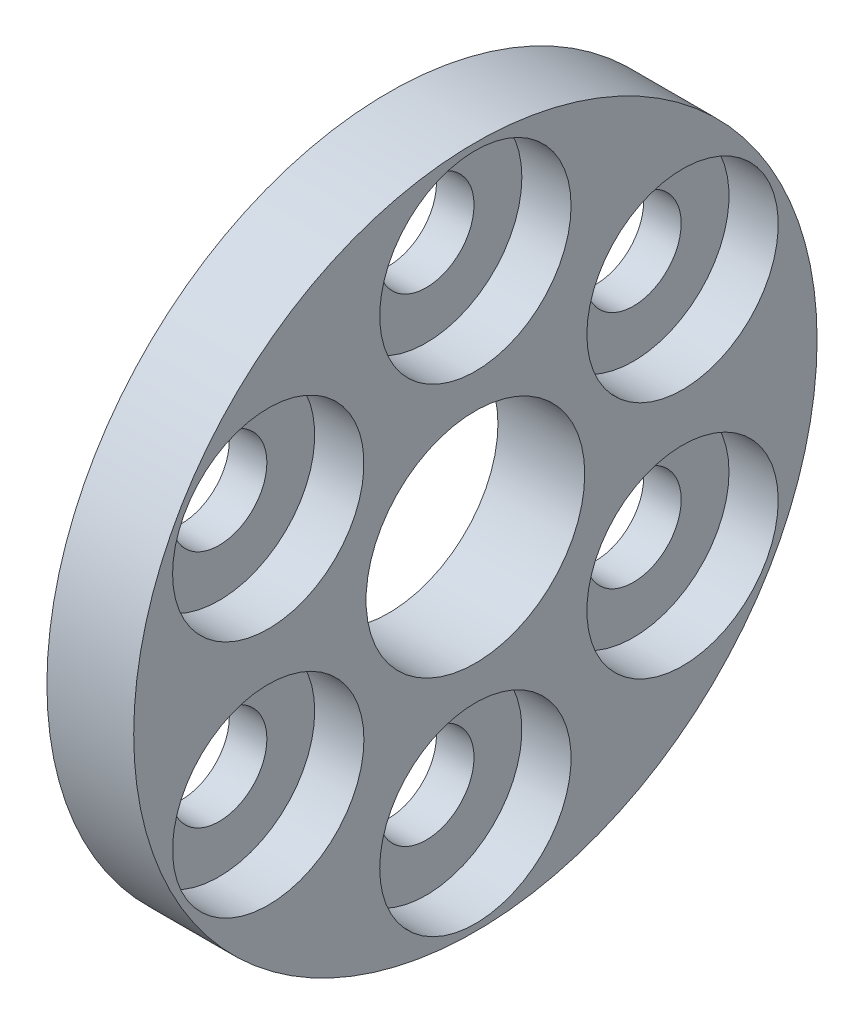
ISO-10303-21;
HEADER;
FILE_DESCRIPTION(('STEP AP214'),'2;1');
FILE_NAME('part.step','',(''),(''),'','','');
FILE_SCHEMA(('AUTOMOTIVE_DESIGN { 1 0 10303 214 1 1 1 1 }'));
ENDSEC;
DATA;
#1=APPLICATION_CONTEXT('core data for automotive mechanical design processes');
#2=APPLICATION_PROTOCOL_DEFINITION('international standard','automotive_design',2000,#1);
#3=PRODUCT_CONTEXT('',#1,'mechanical');
#4=PRODUCT('Part','Part','',(#3));
#5=PRODUCT_RELATED_PRODUCT_CATEGORY('part','',(#4));
#6=PRODUCT_DEFINITION_FORMATION('','',#4);
#7=PRODUCT_DEFINITION_CONTEXT('part definition',#1,'design');
#8=PRODUCT_DEFINITION('design','',#6,#7);
#9=PRODUCT_DEFINITION_SHAPE('','',#8);
#10=(LENGTH_UNIT() NAMED_UNIT(*) SI_UNIT(.MILLI.,.METRE.));
#11=(NAMED_UNIT(*) PLANE_ANGLE_UNIT() SI_UNIT($,.RADIAN.));
#12=(NAMED_UNIT(*) SI_UNIT($,.STERADIAN.) SOLID_ANGLE_UNIT());
#13=UNCERTAINTY_MEASURE_WITH_UNIT(LENGTH_MEASURE(1.E-05),#10,'distance_accuracy_value','');
#14=(GEOMETRIC_REPRESENTATION_CONTEXT(3) GLOBAL_UNCERTAINTY_ASSIGNED_CONTEXT((#13)) GLOBAL_UNIT_ASSIGNED_CONTEXT((#10,
#11,#12)) REPRESENTATION_CONTEXT('',''));
#15=CARTESIAN_POINT('',(0.,0.,0.));
#16=DIRECTION('',(0.,0.,1.));
#17=DIRECTION('',(1.,0.,0.));
#18=AXIS2_PLACEMENT_3D('',#15,#16,#17);
#19=CARTESIAN_POINT('',(0.,4.37499999999998,7.57772228311385));
#20=DIRECTION('',(1.,0.,0.));
#21=DIRECTION('',(0.,0.,-1.));
#22=AXIS2_PLACEMENT_3D('',#19,#20,#21);
#23=CYLINDRICAL_SURFACE('',#22,1.75);
#24=CARTESIAN_POINT('',(0.,4.37499999999998,7.57772228311385));
#25=DIRECTION('',(1.,0.,0.));
#26=DIRECTION('',(0.,0.86602540378444,-0.499999999999998));
#27=AXIS2_PLACEMENT_3D('',#24,#25,#26);
#28=CIRCLE('',#27,1.75);
#29=CARTESIAN_POINT('',(0.,5.89054445662275,6.70272228311385));
#30=VERTEX_POINT('',#29);
#31=EDGE_CURVE('E382',#30,#30,#28,.T.);
#32=ORIENTED_EDGE('',*,*,#31,.F.);
#33=EDGE_LOOP('',(#32));
#34=FACE_BOUND('',#33,.T.);
#35=CARTESIAN_POINT('',(1.375,4.37499999999998,7.57772228311385));
#36=DIRECTION('',(1.,0.,0.));
#37=DIRECTION('',(0.,0.,-1.));
#38=AXIS2_PLACEMENT_3D('',#35,#36,#37);
#39=CIRCLE('',#38,1.75);
#40=CARTESIAN_POINT('',(1.375,4.37499999999998,5.82772228311385));
#41=VERTEX_POINT('',#40);
#42=EDGE_CURVE('E335',#41,#41,#39,.F.);
#43=ORIENTED_EDGE('',*,*,#42,.F.);
#44=EDGE_LOOP('',(#43));
#45=FACE_BOUND('',#44,.T.);
#46=ADVANCED_FACE('F331',(#34,#45),#23,.F.);
#47=CARTESIAN_POINT('',(0.,-4.37500000000004,7.57772228311382));
#48=DIRECTION('',(1.,0.,0.));
#49=DIRECTION('',(0.,0.,-1.));
#50=AXIS2_PLACEMENT_3D('',#47,#48,#49);
#51=CYLINDRICAL_SURFACE('',#50,1.75);
#52=CARTESIAN_POINT('',(0.,-4.37500000000004,7.57772228311382));
#53=DIRECTION('',(1.,0.,0.));
#54=DIRECTION('',(0.,0.866025403784436,0.500000000000004));
#55=AXIS2_PLACEMENT_3D('',#52,#53,#54);
#56=CIRCLE('',#55,1.75);
#57=CARTESIAN_POINT('',(0.,-2.85945554337727,8.45272228311383));
#58=VERTEX_POINT('',#57);
#59=EDGE_CURVE('E386',#58,#58,#56,.T.);
#60=ORIENTED_EDGE('',*,*,#59,.F.);
#61=EDGE_LOOP('',(#60));
#62=FACE_BOUND('',#61,.T.);
#63=CARTESIAN_POINT('',(1.375,-4.37500000000004,7.57772228311382));
#64=DIRECTION('',(1.,0.,0.));
#65=DIRECTION('',(0.,0.,-1.));
#66=AXIS2_PLACEMENT_3D('',#63,#64,#65);
#67=CIRCLE('',#66,1.75);
#68=CARTESIAN_POINT('',(1.375,-4.37500000000004,5.82772228311382));
#69=VERTEX_POINT('',#68);
#70=EDGE_CURVE('E364',#69,#69,#67,.F.);
#71=ORIENTED_EDGE('',*,*,#70,.F.);
#72=EDGE_LOOP('',(#71));
#73=FACE_BOUND('',#72,.T.);
#74=ADVANCED_FACE('F416',(#62,#73),#51,.F.);
#75=CARTESIAN_POINT('',(0.,-8.75,0.));
#76=DIRECTION('',(1.,0.,0.));
#77=DIRECTION('',(0.,0.,-1.));
#78=AXIS2_PLACEMENT_3D('',#75,#76,#77);
#79=CYLINDRICAL_SURFACE('',#78,1.75);
#80=CARTESIAN_POINT('',(0.,-8.75,0.));
#81=DIRECTION('',(1.,0.,0.));
#82=DIRECTION('',(0.,0.,1.));
#83=AXIS2_PLACEMENT_3D('',#80,#81,#82);
#84=CIRCLE('',#83,1.75);
#85=CARTESIAN_POINT('',(0.,-8.75,1.75));
#86=VERTEX_POINT('',#85);
#87=EDGE_CURVE('E378',#86,#86,#84,.T.);
#88=ORIENTED_EDGE('',*,*,#87,.F.);
#89=EDGE_LOOP('',(#88));
#90=FACE_BOUND('',#89,.T.);
#91=CARTESIAN_POINT('',(1.375,-8.75,0.));
#92=DIRECTION('',(1.,0.,0.));
#93=DIRECTION('',(0.,0.,-1.));
#94=AXIS2_PLACEMENT_3D('',#91,#92,#93);
#95=CIRCLE('',#94,1.75);
#96=CARTESIAN_POINT('',(1.375,-8.75,-1.75));
#97=VERTEX_POINT('',#96);
#98=EDGE_CURVE('E362',#97,#97,#95,.F.);
#99=ORIENTED_EDGE('',*,*,#98,.F.);
#100=EDGE_LOOP('',(#99));
#101=FACE_BOUND('',#100,.T.);
#102=ADVANCED_FACE('F422',(#90,#101),#79,.F.);
#103=CARTESIAN_POINT('',(0.,-4.37499999999993,-7.57772228311388));
#104=DIRECTION('',(1.,0.,0.));
#105=DIRECTION('',(0.,0.,-1.));
#106=AXIS2_PLACEMENT_3D('',#103,#104,#105);
#107=CYLINDRICAL_SURFACE('',#106,1.75);
#108=CARTESIAN_POINT('',(0.,-4.37499999999993,-7.57772228311388));
#109=DIRECTION('',(1.,0.,0.));
#110=DIRECTION('',(0.,-0.866025403784443,0.499999999999992));
#111=AXIS2_PLACEMENT_3D('',#108,#109,#110);
#112=CIRCLE('',#111,1.75);
#113=CARTESIAN_POINT('',(0.,-5.89054445662271,-6.70272228311389));
#114=VERTEX_POINT('',#113);
#115=EDGE_CURVE('E373',#114,#114,#112,.T.);
#116=ORIENTED_EDGE('',*,*,#115,.F.);
#117=EDGE_LOOP('',(#116));
#118=FACE_BOUND('',#117,.T.);
#119=CARTESIAN_POINT('',(1.375,-4.37499999999993,-7.57772228311388));
#120=DIRECTION('',(1.,0.,0.));
#121=DIRECTION('',(0.,0.,-1.));
#122=AXIS2_PLACEMENT_3D('',#119,#120,#121);
#123=CIRCLE('',#122,1.75);
#124=CARTESIAN_POINT('',(1.375,-4.37499999999993,-9.32772228311388));
#125=VERTEX_POINT('',#124);
#126=EDGE_CURVE('E358',#125,#125,#123,.F.);
#127=ORIENTED_EDGE('',*,*,#126,.F.);
#128=EDGE_LOOP('',(#127));
#129=FACE_BOUND('',#128,.T.);
#130=ADVANCED_FACE('F482',(#118,#129),#107,.F.);
#131=CARTESIAN_POINT('',(0.,4.37500000000009,-7.57772228311379));
#132=DIRECTION('',(1.,0.,0.));
#133=DIRECTION('',(0.,0.,-1.));
#134=AXIS2_PLACEMENT_3D('',#131,#132,#133);
#135=CYLINDRICAL_SURFACE('',#134,1.75);
#136=CARTESIAN_POINT('',(0.,4.37500000000009,-7.57772228311379));
#137=DIRECTION('',(1.,0.,0.));
#138=DIRECTION('',(0.,-0.866025403784433,-0.50000000000001));
#139=AXIS2_PLACEMENT_3D('',#136,#137,#138);
#140=CIRCLE('',#139,1.75);
#141=CARTESIAN_POINT('',(0.,2.85945554337733,-8.45272228311381));
#142=VERTEX_POINT('',#141);
#143=EDGE_CURVE('E369',#142,#142,#140,.T.);
#144=ORIENTED_EDGE('',*,*,#143,.F.);
#145=EDGE_LOOP('',(#144));
#146=FACE_BOUND('',#145,.T.);
#147=CARTESIAN_POINT('',(1.375,4.37500000000009,-7.57772228311379));
#148=DIRECTION('',(1.,0.,0.));
#149=DIRECTION('',(0.,0.,-1.));
#150=AXIS2_PLACEMENT_3D('',#147,#148,#149);
#151=CIRCLE('',#150,1.75);
#152=CARTESIAN_POINT('',(1.375,4.37500000000009,-9.32772228311379));
#153=VERTEX_POINT('',#152);
#154=EDGE_CURVE('E355',#153,#153,#151,.F.);
#155=ORIENTED_EDGE('',*,*,#154,.F.);
#156=EDGE_LOOP('',(#155));
#157=FACE_BOUND('',#156,.T.);
#158=ADVANCED_FACE('F429',(#146,#157),#135,.F.);
#159=CARTESIAN_POINT('',(0.,8.75,0.));
#160=DIRECTION('',(1.,0.,0.));
#161=DIRECTION('',(0.,0.,-1.));
#162=AXIS2_PLACEMENT_3D('',#159,#160,#161);
#163=CYLINDRICAL_SURFACE('',#162,1.75);
#164=CARTESIAN_POINT('',(0.,8.75,0.));
#165=DIRECTION('',(1.,0.,0.));
#166=DIRECTION('',(0.,0.,-1.));
#167=AXIS2_PLACEMENT_3D('',#164,#165,#166);
#168=CIRCLE('',#167,1.75);
#169=CARTESIAN_POINT('',(0.,8.75,-1.75));
#170=VERTEX_POINT('',#169);
#171=EDGE_CURVE('E353',#170,#170,#168,.T.);
#172=ORIENTED_EDGE('',*,*,#171,.F.);
#173=EDGE_LOOP('',(#172));
#174=FACE_BOUND('',#173,.T.);
#175=CARTESIAN_POINT('',(1.375,8.75,0.));
#176=DIRECTION('',(1.,0.,0.));
#177=DIRECTION('',(0.,0.,-1.));
#178=AXIS2_PLACEMENT_3D('',#175,#176,#177);
#179=CIRCLE('',#178,1.75);
#180=CARTESIAN_POINT('',(1.375,8.75,-1.75));
#181=VERTEX_POINT('',#180);
#182=EDGE_CURVE('E350',#181,#181,#179,.F.);
#183=ORIENTED_EDGE('',*,*,#182,.F.);
#184=EDGE_LOOP('',(#183));
#185=FACE_BOUND('',#184,.T.);
#186=ADVANCED_FACE('F410',(#174,#185),#163,.F.);
#187=CARTESIAN_POINT('',(3.175,0.,0.));
#188=DIRECTION('',(-1.,0.,0.));
#189=DIRECTION('',(0.,0.,1.));
#190=AXIS2_PLACEMENT_3D('',#187,#188,#189);
#191=CYLINDRICAL_SURFACE('',#190,12.5);
#192=CARTESIAN_POINT('',(3.175,0.,0.));
#193=DIRECTION('',(1.,0.,0.));
#194=DIRECTION('',(0.,0.,-1.));
#195=AXIS2_PLACEMENT_3D('',#192,#193,#194);
#196=CIRCLE('',#195,12.5);
#197=CARTESIAN_POINT('',(3.175,0.,-12.5));
#198=VERTEX_POINT('',#197);
#199=EDGE_CURVE('E11',#198,#198,#196,.T.);
#200=ORIENTED_EDGE('',*,*,#199,.F.);
#201=EDGE_LOOP('',(#200));
#202=FACE_BOUND('',#201,.T.);
#203=CARTESIAN_POINT('',(0.,0.,0.));
#204=DIRECTION('',(1.,0.,0.));
#205=DIRECTION('',(0.,0.,-1.));
#206=AXIS2_PLACEMENT_3D('',#203,#204,#205);
#207=CIRCLE('',#206,12.5);
#208=CARTESIAN_POINT('',(0.,0.,-12.5));
#209=VERTEX_POINT('',#208);
#210=EDGE_CURVE('E339',#209,#209,#207,.T.);
#211=ORIENTED_EDGE('',*,*,#210,.T.);
#212=EDGE_LOOP('',(#211));
#213=FACE_BOUND('',#212,.T.);
#214=ADVANCED_FACE('F333',(#202,#213),#191,.T.);
#215=CARTESIAN_POINT('',(3.175,0.,0.));
#216=DIRECTION('',(1.,0.,0.));
#217=DIRECTION('',(0.,0.,-1.));
#218=AXIS2_PLACEMENT_3D('',#215,#216,#217);
#219=PLANE('',#218);
#220=CARTESIAN_POINT('',(3.175,4.37500000000009,-7.57772228311379));
#221=DIRECTION('',(1.,0.,0.));
#222=DIRECTION('',(0.,-0.866025403784433,-0.50000000000001));
#223=AXIS2_PLACEMENT_3D('',#220,#221,#222);
#224=CIRCLE('',#223,3.5);
#225=CARTESIAN_POINT('',(3.175,1.34391108675457,-9.32772228311382));
#226=VERTEX_POINT('',#225);
#227=EDGE_CURVE('E651',#226,#226,#224,.T.);
#228=ORIENTED_EDGE('',*,*,#227,.F.);
#229=EDGE_LOOP('',(#228));
#230=FACE_BOUND('',#229,.T.);
#231=CARTESIAN_POINT('',(3.175,-4.37499999999993,-7.57772228311388));
#232=DIRECTION('',(1.,0.,0.));
#233=DIRECTION('',(0.,-0.866025403784443,0.499999999999992));
#234=AXIS2_PLACEMENT_3D('',#231,#232,#233);
#235=CIRCLE('',#234,3.5);
#236=CARTESIAN_POINT('',(3.175,-7.40608891324548,-5.82772228311391));
#237=VERTEX_POINT('',#236);
#238=EDGE_CURVE('E643',#237,#237,#235,.T.);
#239=ORIENTED_EDGE('',*,*,#238,.F.);
#240=EDGE_LOOP('',(#239));
#241=FACE_BOUND('',#240,.T.);
#242=CARTESIAN_POINT('',(3.175,-4.37500000000004,7.57772228311382));
#243=DIRECTION('',(1.,0.,0.));
#244=DIRECTION('',(0.,0.866025403784436,0.500000000000004));
#245=AXIS2_PLACEMENT_3D('',#242,#243,#244);
#246=CIRCLE('',#245,3.5);
#247=CARTESIAN_POINT('',(3.175,-1.34391108675451,9.32772228311383));
#248=VERTEX_POINT('',#247);
#249=EDGE_CURVE('E620',#248,#248,#246,.T.);
#250=ORIENTED_EDGE('',*,*,#249,.F.);
#251=EDGE_LOOP('',(#250));
#252=FACE_BOUND('',#251,.T.);
#253=CARTESIAN_POINT('',(3.175,-8.75,0.));
#254=DIRECTION('',(1.,0.,0.));
#255=DIRECTION('',(0.,0.,1.));
#256=AXIS2_PLACEMENT_3D('',#253,#254,#255);
#257=CIRCLE('',#256,3.5);
#258=CARTESIAN_POINT('',(3.175,-8.75,3.5));
#259=VERTEX_POINT('',#258);
#260=EDGE_CURVE('E650',#259,#259,#257,.T.);
#261=ORIENTED_EDGE('',*,*,#260,.F.);
#262=EDGE_LOOP('',(#261));
#263=FACE_BOUND('',#262,.T.);
#264=CARTESIAN_POINT('',(3.175,4.37499999999998,7.57772228311385));
#265=DIRECTION('',(1.,0.,0.));
#266=DIRECTION('',(0.,0.86602540378444,-0.499999999999998));
#267=AXIS2_PLACEMENT_3D('',#264,#265,#266);
#268=CIRCLE('',#267,3.5);
#269=CARTESIAN_POINT('',(3.175,7.40608891324552,5.82772228311386));
#270=VERTEX_POINT('',#269);
#271=EDGE_CURVE('E614',#270,#270,#268,.T.);
#272=ORIENTED_EDGE('',*,*,#271,.F.);
#273=EDGE_LOOP('',(#272));
#274=FACE_BOUND('',#273,.T.);
#275=CARTESIAN_POINT('',(3.175,8.75,0.));
#276=DIRECTION('',(1.,0.,0.));
#277=DIRECTION('',(0.,0.,-1.));
#278=AXIS2_PLACEMENT_3D('',#275,#276,#277);
#279=CIRCLE('',#278,3.5);
#280=CARTESIAN_POINT('',(3.175,8.75,-3.5));
#281=VERTEX_POINT('',#280);
#282=EDGE_CURVE('E385',#281,#281,#279,.T.);
#283=ORIENTED_EDGE('',*,*,#282,.F.);
#284=EDGE_LOOP('',(#283));
#285=FACE_BOUND('',#284,.T.);
#286=CARTESIAN_POINT('',(3.175,0.,0.));
#287=DIRECTION('',(1.,0.,0.));
#288=DIRECTION('',(0.,0.,-1.));
#289=AXIS2_PLACEMENT_3D('',#286,#287,#288);
#290=CIRCLE('',#289,4.);
#291=CARTESIAN_POINT('',(3.175,0.,-4.));
#292=VERTEX_POINT('',#291);
#293=EDGE_CURVE('E347',#292,#292,#290,.T.);
#294=ORIENTED_EDGE('',*,*,#293,.F.);
#295=EDGE_LOOP('',(#294));
#296=FACE_BOUND('',#295,.T.);
#297=ORIENTED_EDGE('',*,*,#199,.T.);
#298=EDGE_LOOP('',(#297));
#299=FACE_BOUND('',#298,.T.);
#300=ADVANCED_FACE('F400',(#230,#241,#252,#263,#274,#285,#296,#299),#219,.T.);
#301=CARTESIAN_POINT('',(0.,0.,0.));
#302=DIRECTION('',(1.,0.,0.));
#303=DIRECTION('',(0.,0.,-1.));
#304=AXIS2_PLACEMENT_3D('',#301,#302,#303);
#305=PLANE('',#304);
#306=ORIENTED_EDGE('',*,*,#143,.T.);
#307=EDGE_LOOP('',(#306));
#308=FACE_BOUND('',#307,.T.);
#309=ORIENTED_EDGE('',*,*,#115,.T.);
#310=EDGE_LOOP('',(#309));
#311=FACE_BOUND('',#310,.T.);
#312=ORIENTED_EDGE('',*,*,#87,.T.);
#313=EDGE_LOOP('',(#312));
#314=FACE_BOUND('',#313,.T.);
#315=ORIENTED_EDGE('',*,*,#59,.T.);
#316=EDGE_LOOP('',(#315));
#317=FACE_BOUND('',#316,.T.);
#318=ORIENTED_EDGE('',*,*,#31,.T.);
#319=EDGE_LOOP('',(#318));
#320=FACE_BOUND('',#319,.T.);
#321=ORIENTED_EDGE('',*,*,#171,.T.);
#322=EDGE_LOOP('',(#321));
#323=FACE_BOUND('',#322,.T.);
#324=CARTESIAN_POINT('',(0.,0.,0.));
#325=DIRECTION('',(1.,0.,0.));
#326=DIRECTION('',(0.,0.,-1.));
#327=AXIS2_PLACEMENT_3D('',#324,#325,#326);
#328=CIRCLE('',#327,4.);
#329=CARTESIAN_POINT('',(0.,0.,-4.));
#330=VERTEX_POINT('',#329);
#331=EDGE_CURVE('E344',#330,#330,#328,.T.);
#332=ORIENTED_EDGE('',*,*,#331,.T.);
#333=EDGE_LOOP('',(#332));
#334=FACE_BOUND('',#333,.T.);
#335=ORIENTED_EDGE('',*,*,#210,.F.);
#336=EDGE_LOOP('',(#335));
#337=FACE_BOUND('',#336,.T.);
#338=ADVANCED_FACE('F402',(#308,#311,#314,#317,#320,#323,#334,#337),#305,.F.);
#339=CARTESIAN_POINT('',(0.,0.,0.));
#340=DIRECTION('',(1.,0.,0.));
#341=DIRECTION('',(0.,0.,-1.));
#342=AXIS2_PLACEMENT_3D('',#339,#340,#341);
#343=CYLINDRICAL_SURFACE('',#342,4.);
#344=ORIENTED_EDGE('',*,*,#331,.F.);
#345=EDGE_LOOP('',(#344));
#346=FACE_BOUND('',#345,.T.);
#347=ORIENTED_EDGE('',*,*,#293,.T.);
#348=EDGE_LOOP('',(#347));
#349=FACE_BOUND('',#348,.T.);
#350=ADVANCED_FACE('F398',(#346,#349),#343,.F.);
#351=CARTESIAN_POINT('',(1.375,0.,0.));
#352=DIRECTION('',(1.,0.,0.));
#353=DIRECTION('',(0.,0.,-1.));
#354=AXIS2_PLACEMENT_3D('',#351,#352,#353);
#355=PLANE('',#354);
#356=CARTESIAN_POINT('',(1.375,8.75,0.));
#357=DIRECTION('',(1.,0.,0.));
#358=DIRECTION('',(0.,0.,-1.));
#359=AXIS2_PLACEMENT_3D('',#356,#357,#358);
#360=CIRCLE('',#359,3.5);
#361=CARTESIAN_POINT('',(1.375,8.75,-3.5));
#362=VERTEX_POINT('',#361);
#363=EDGE_CURVE('E354',#362,#362,#360,.T.);
#364=ORIENTED_EDGE('',*,*,#363,.T.);
#365=EDGE_LOOP('',(#364));
#366=FACE_BOUND('',#365,.T.);
#367=ORIENTED_EDGE('',*,*,#182,.T.);
#368=EDGE_LOOP('',(#367));
#369=FACE_BOUND('',#368,.T.);
#370=ADVANCED_FACE('F431',(#366,#369),#355,.T.);
#371=CARTESIAN_POINT('',(1.375,8.75,0.));
#372=DIRECTION('',(1.,0.,0.));
#373=DIRECTION('',(0.,0.,-1.));
#374=AXIS2_PLACEMENT_3D('',#371,#372,#373);
#375=CYLINDRICAL_SURFACE('',#374,3.5);
#376=ORIENTED_EDGE('',*,*,#363,.F.);
#377=EDGE_LOOP('',(#376));
#378=FACE_BOUND('',#377,.T.);
#379=ORIENTED_EDGE('',*,*,#282,.T.);
#380=EDGE_LOOP('',(#379));
#381=FACE_BOUND('',#380,.T.);
#382=ADVANCED_FACE('F434',(#378,#381),#375,.F.);
#383=CARTESIAN_POINT('',(1.375,0.,0.));
#384=DIRECTION('',(1.,0.,0.));
#385=DIRECTION('',(0.,-0.866025403784433,-0.50000000000001));
#386=AXIS2_PLACEMENT_3D('',#383,#384,#385);
#387=PLANE('',#386);
#388=CARTESIAN_POINT('',(1.375,4.37500000000009,-7.57772228311379));
#389=DIRECTION('',(1.,0.,0.));
#390=DIRECTION('',(0.,-0.866025403784433,-0.50000000000001));
#391=AXIS2_PLACEMENT_3D('',#388,#389,#390);
#392=CIRCLE('',#391,3.5);
#393=CARTESIAN_POINT('',(1.375,1.34391108675457,-9.32772228311382));
#394=VERTEX_POINT('',#393);
#395=EDGE_CURVE('E647',#394,#394,#392,.T.);
#396=ORIENTED_EDGE('',*,*,#395,.T.);
#397=EDGE_LOOP('',(#396));
#398=FACE_BOUND('',#397,.T.);
#399=ORIENTED_EDGE('',*,*,#154,.T.);
#400=EDGE_LOOP('',(#399));
#401=FACE_BOUND('',#400,.T.);
#402=ADVANCED_FACE('F438',(#398,#401),#387,.T.);
#403=CARTESIAN_POINT('',(1.375,4.37500000000009,-7.57772228311379));
#404=DIRECTION('',(1.,0.,0.));
#405=DIRECTION('',(0.,0.,-1.));
#406=AXIS2_PLACEMENT_3D('',#403,#404,#405);
#407=CYLINDRICAL_SURFACE('',#406,3.5);
#408=ORIENTED_EDGE('',*,*,#395,.F.);
#409=EDGE_LOOP('',(#408));
#410=FACE_BOUND('',#409,.T.);
#411=ORIENTED_EDGE('',*,*,#227,.T.);
#412=EDGE_LOOP('',(#411));
#413=FACE_BOUND('',#412,.T.);
#414=ADVANCED_FACE('F516',(#410,#413),#407,.F.);
#415=CARTESIAN_POINT('',(1.375,0.,0.));
#416=DIRECTION('',(1.,0.,0.));
#417=DIRECTION('',(0.,-0.866025403784443,0.499999999999992));
#418=AXIS2_PLACEMENT_3D('',#415,#416,#417);
#419=PLANE('',#418);
#420=CARTESIAN_POINT('',(1.375,-4.37499999999993,-7.57772228311388));
#421=DIRECTION('',(1.,0.,0.));
#422=DIRECTION('',(0.,-0.866025403784443,0.499999999999992));
#423=AXIS2_PLACEMENT_3D('',#420,#421,#422);
#424=CIRCLE('',#423,3.5);
#425=CARTESIAN_POINT('',(1.375,-7.40608891324548,-5.82772228311391));
#426=VERTEX_POINT('',#425);
#427=EDGE_CURVE('E646',#426,#426,#424,.T.);
#428=ORIENTED_EDGE('',*,*,#427,.T.);
#429=EDGE_LOOP('',(#428));
#430=FACE_BOUND('',#429,.T.);
#431=ORIENTED_EDGE('',*,*,#126,.T.);
#432=EDGE_LOOP('',(#431));
#433=FACE_BOUND('',#432,.T.);
#434=ADVANCED_FACE('F526',(#430,#433),#419,.T.);
#435=CARTESIAN_POINT('',(1.375,-4.37499999999993,-7.57772228311388));
#436=DIRECTION('',(1.,0.,0.));
#437=DIRECTION('',(0.,0.,-1.));
#438=AXIS2_PLACEMENT_3D('',#435,#436,#437);
#439=CYLINDRICAL_SURFACE('',#438,3.5);
#440=ORIENTED_EDGE('',*,*,#427,.F.);
#441=EDGE_LOOP('',(#440));
#442=FACE_BOUND('',#441,.T.);
#443=ORIENTED_EDGE('',*,*,#238,.T.);
#444=EDGE_LOOP('',(#443));
#445=FACE_BOUND('',#444,.T.);
#446=ADVANCED_FACE('F536',(#442,#445),#439,.F.);
#447=CARTESIAN_POINT('',(1.375,0.,0.));
#448=DIRECTION('',(1.,0.,0.));
#449=DIRECTION('',(0.,0.,1.));
#450=AXIS2_PLACEMENT_3D('',#447,#448,#449);
#451=PLANE('',#450);
#452=CARTESIAN_POINT('',(1.375,-8.75,0.));
#453=DIRECTION('',(1.,0.,0.));
#454=DIRECTION('',(0.,0.,1.));
#455=AXIS2_PLACEMENT_3D('',#452,#453,#454);
#456=CIRCLE('',#455,3.5);
#457=CARTESIAN_POINT('',(1.375,-8.75,3.5));
#458=VERTEX_POINT('',#457);
#459=EDGE_CURVE('E657',#458,#458,#456,.T.);
#460=ORIENTED_EDGE('',*,*,#459,.T.);
#461=EDGE_LOOP('',(#460));
#462=FACE_BOUND('',#461,.T.);
#463=ORIENTED_EDGE('',*,*,#98,.T.);
#464=EDGE_LOOP('',(#463));
#465=FACE_BOUND('',#464,.T.);
#466=ADVANCED_FACE('F546',(#462,#465),#451,.T.);
#467=CARTESIAN_POINT('',(1.375,-8.75,0.));
#468=DIRECTION('',(1.,0.,0.));
#469=DIRECTION('',(0.,0.,-1.));
#470=AXIS2_PLACEMENT_3D('',#467,#468,#469);
#471=CYLINDRICAL_SURFACE('',#470,3.5);
#472=ORIENTED_EDGE('',*,*,#459,.F.);
#473=EDGE_LOOP('',(#472));
#474=FACE_BOUND('',#473,.T.);
#475=ORIENTED_EDGE('',*,*,#260,.T.);
#476=EDGE_LOOP('',(#475));
#477=FACE_BOUND('',#476,.T.);
#478=ADVANCED_FACE('F556',(#474,#477),#471,.F.);
#479=CARTESIAN_POINT('',(1.375,0.,0.));
#480=DIRECTION('',(1.,0.,0.));
#481=DIRECTION('',(0.,0.866025403784436,0.500000000000004));
#482=AXIS2_PLACEMENT_3D('',#479,#480,#481);
#483=PLANE('',#482);
#484=CARTESIAN_POINT('',(1.375,-4.37500000000004,7.57772228311382));
#485=DIRECTION('',(1.,0.,0.));
#486=DIRECTION('',(0.,0.866025403784436,0.500000000000004));
#487=AXIS2_PLACEMENT_3D('',#484,#485,#486);
#488=CIRCLE('',#487,3.5);
#489=CARTESIAN_POINT('',(1.375,-1.34391108675451,9.32772228311383));
#490=VERTEX_POINT('',#489);
#491=EDGE_CURVE('E616',#490,#490,#488,.T.);
#492=ORIENTED_EDGE('',*,*,#491,.T.);
#493=EDGE_LOOP('',(#492));
#494=FACE_BOUND('',#493,.T.);
#495=ORIENTED_EDGE('',*,*,#70,.T.);
#496=EDGE_LOOP('',(#495));
#497=FACE_BOUND('',#496,.T.);
#498=ADVANCED_FACE('F566',(#494,#497),#483,.T.);
#499=CARTESIAN_POINT('',(1.375,-4.37500000000004,7.57772228311382));
#500=DIRECTION('',(1.,0.,0.));
#501=DIRECTION('',(0.,0.,-1.));
#502=AXIS2_PLACEMENT_3D('',#499,#500,#501);
#503=CYLINDRICAL_SURFACE('',#502,3.5);
#504=ORIENTED_EDGE('',*,*,#491,.F.);
#505=EDGE_LOOP('',(#504));
#506=FACE_BOUND('',#505,.T.);
#507=ORIENTED_EDGE('',*,*,#249,.T.);
#508=EDGE_LOOP('',(#507));
#509=FACE_BOUND('',#508,.T.);
#510=ADVANCED_FACE('F576',(#506,#509),#503,.F.);
#511=CARTESIAN_POINT('',(1.375,0.,0.));
#512=DIRECTION('',(1.,0.,0.));
#513=DIRECTION('',(0.,0.86602540378444,-0.499999999999998));
#514=AXIS2_PLACEMENT_3D('',#511,#512,#513);
#515=PLANE('',#514);
#516=CARTESIAN_POINT('',(1.375,4.37499999999998,7.57772228311385));
#517=DIRECTION('',(1.,0.,0.));
#518=DIRECTION('',(0.,0.86602540378444,-0.499999999999998));
#519=AXIS2_PLACEMENT_3D('',#516,#517,#518);
#520=CIRCLE('',#519,3.5);
#521=CARTESIAN_POINT('',(1.375,7.40608891324552,5.82772228311386));
#522=VERTEX_POINT('',#521);
#523=EDGE_CURVE('E359',#522,#522,#520,.T.);
#524=ORIENTED_EDGE('',*,*,#523,.T.);
#525=EDGE_LOOP('',(#524));
#526=FACE_BOUND('',#525,.T.);
#527=ORIENTED_EDGE('',*,*,#42,.T.);
#528=EDGE_LOOP('',(#527));
#529=FACE_BOUND('',#528,.T.);
#530=ADVANCED_FACE('F586',(#526,#529),#515,.T.);
#531=CARTESIAN_POINT('',(1.375,4.37499999999998,7.57772228311385));
#532=DIRECTION('',(1.,0.,0.));
#533=DIRECTION('',(0.,0.,-1.));
#534=AXIS2_PLACEMENT_3D('',#531,#532,#533);
#535=CYLINDRICAL_SURFACE('',#534,3.5);
#536=ORIENTED_EDGE('',*,*,#523,.F.);
#537=EDGE_LOOP('',(#536));
#538=FACE_BOUND('',#537,.T.);
#539=ORIENTED_EDGE('',*,*,#271,.T.);
#540=EDGE_LOOP('',(#539));
#541=FACE_BOUND('',#540,.T.);
#542=ADVANCED_FACE('F596',(#538,#541),#535,.F.);
#543=CLOSED_SHELL('',(#46,#74,#102,#130,#158,#186,#214,#300,#338,#350,#370,#382,#402,#414,#434,
#446,#466,#478,#498,#510,#530,#542));
#544=MANIFOLD_SOLID_BREP('B2',#543);
#545=ADVANCED_BREP_SHAPE_REPRESENTATION('',(#18,#544),#14);
#546=SHAPE_DEFINITION_REPRESENTATION(#9,#545);
ENDSEC;
END-ISO-10303-21;
